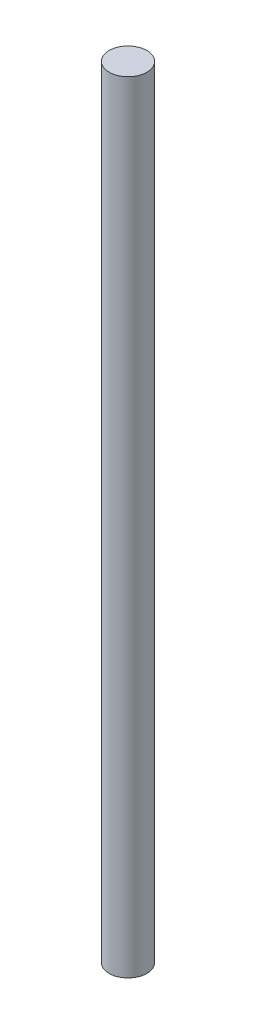
ISO-10303-21;
HEADER;
FILE_DESCRIPTION(('STEP AP214'),'2;1');
FILE_NAME('part.step','',(''),(''),'','','');
FILE_SCHEMA(('AUTOMOTIVE_DESIGN { 1 0 10303 214 1 1 1 1 }'));
ENDSEC;
DATA;
#1=APPLICATION_CONTEXT('core data for automotive mechanical design processes');
#2=APPLICATION_PROTOCOL_DEFINITION('international standard','automotive_design',2000,#1);
#3=PRODUCT_CONTEXT('',#1,'mechanical');
#4=PRODUCT('Part','Part','',(#3));
#5=PRODUCT_RELATED_PRODUCT_CATEGORY('part','',(#4));
#6=PRODUCT_DEFINITION_FORMATION('','',#4);
#7=PRODUCT_DEFINITION_CONTEXT('part definition',#1,'design');
#8=PRODUCT_DEFINITION('design','',#6,#7);
#9=PRODUCT_DEFINITION_SHAPE('','',#8);
#10=(LENGTH_UNIT() NAMED_UNIT(*) SI_UNIT(.MILLI.,.METRE.));
#11=(NAMED_UNIT(*) PLANE_ANGLE_UNIT() SI_UNIT($,.RADIAN.));
#12=(NAMED_UNIT(*) SI_UNIT($,.STERADIAN.) SOLID_ANGLE_UNIT());
#13=UNCERTAINTY_MEASURE_WITH_UNIT(LENGTH_MEASURE(1.E-05),#10,'distance_accuracy_value','');
#14=(GEOMETRIC_REPRESENTATION_CONTEXT(3) GLOBAL_UNCERTAINTY_ASSIGNED_CONTEXT((#13)) GLOBAL_UNIT_ASSIGNED_CONTEXT((#10,
#11,#12)) REPRESENTATION_CONTEXT('',''));
#15=CARTESIAN_POINT('',(0.,0.,0.));
#16=DIRECTION('',(0.,0.,1.));
#17=DIRECTION('',(1.,0.,0.));
#18=AXIS2_PLACEMENT_3D('',#15,#16,#17);
#19=CARTESIAN_POINT('',(0.,3683.,0.));
#20=DIRECTION('',(0.,-1.,0.));
#21=DIRECTION('',(0.,0.,-1.));
#22=AXIS2_PLACEMENT_3D('',#19,#20,#21);
#23=CYLINDRICAL_SURFACE('',#22,88.9);
#24=CARTESIAN_POINT('',(0.,3683.,0.));
#25=DIRECTION('',(0.,1.,0.));
#26=DIRECTION('',(0.,0.,1.));
#27=AXIS2_PLACEMENT_3D('',#24,#25,#26);
#28=CIRCLE('',#27,88.9);
#29=CARTESIAN_POINT('',(0.,3683.,-88.9));
#30=VERTEX_POINT('',#29);
#31=EDGE_CURVE('E10',#30,#30,#28,.T.);
#32=CARTESIAN_POINT('',(0.,0.,0.));
#33=DIRECTION('',(0.,1.,0.));
#34=DIRECTION('',(0.,0.,1.));
#35=AXIS2_PLACEMENT_3D('',#32,#33,#34);
#36=CIRCLE('',#35,88.9);
#37=CARTESIAN_POINT('',(0.,-4.44089209850063E-13,-88.9));
#38=VERTEX_POINT('',#37);
#39=EDGE_CURVE('E33',#38,#38,#36,.T.);
#40=CARTESIAN_POINT('',(0.,3683.,-88.9));
#41=CARTESIAN_POINT('',(0.,3644.63541666667,-88.9));
#42=CARTESIAN_POINT('',(0.,3606.27083333333,-88.9));
#43=CARTESIAN_POINT('',(0.,3529.54166666667,-88.9));
#44=CARTESIAN_POINT('',(0.,3491.17708333333,-88.9));
#45=CARTESIAN_POINT('',(0.,3414.44791666667,-88.9));
#46=CARTESIAN_POINT('',(0.,3376.08333333333,-88.9));
#47=CARTESIAN_POINT('',(0.,3299.35416666667,-88.9));
#48=CARTESIAN_POINT('',(0.,3260.98958333333,-88.9));
#49=CARTESIAN_POINT('',(0.,3184.26041666667,-88.9));
#50=CARTESIAN_POINT('',(0.,3145.89583333333,-88.9));
#51=CARTESIAN_POINT('',(0.,3069.16666666667,-88.9));
#52=CARTESIAN_POINT('',(0.,3030.80208333333,-88.9));
#53=CARTESIAN_POINT('',(0.,2954.07291666667,-88.9));
#54=CARTESIAN_POINT('',(0.,2915.70833333333,-88.9));
#55=CARTESIAN_POINT('',(0.,2838.97916666667,-88.9));
#56=CARTESIAN_POINT('',(0.,2800.61458333333,-88.9));
#57=CARTESIAN_POINT('',(0.,2723.88541666667,-88.9));
#58=CARTESIAN_POINT('',(0.,2685.52083333333,-88.9));
#59=CARTESIAN_POINT('',(0.,2608.79166666667,-88.9));
#60=CARTESIAN_POINT('',(0.,2570.42708333333,-88.9));
#61=CARTESIAN_POINT('',(0.,2493.69791666667,-88.9));
#62=CARTESIAN_POINT('',(0.,2455.33333333333,-88.9));
#63=CARTESIAN_POINT('',(0.,2378.60416666667,-88.9));
#64=CARTESIAN_POINT('',(0.,2340.23958333333,-88.9));
#65=CARTESIAN_POINT('',(0.,2263.51041666667,-88.9));
#66=CARTESIAN_POINT('',(0.,2225.14583333333,-88.9));
#67=CARTESIAN_POINT('',(0.,2148.41666666667,-88.9));
#68=CARTESIAN_POINT('',(0.,2110.05208333333,-88.9));
#69=CARTESIAN_POINT('',(0.,2033.32291666667,-88.9));
#70=CARTESIAN_POINT('',(0.,1994.95833333333,-88.9));
#71=CARTESIAN_POINT('',(0.,1918.22916666667,-88.9));
#72=CARTESIAN_POINT('',(0.,1879.86458333333,-88.9));
#73=CARTESIAN_POINT('',(0.,1803.13541666667,-88.9));
#74=CARTESIAN_POINT('',(0.,1764.77083333333,-88.9));
#75=CARTESIAN_POINT('',(0.,1688.04166666667,-88.9));
#76=CARTESIAN_POINT('',(0.,1649.67708333333,-88.9));
#77=CARTESIAN_POINT('',(0.,1572.94791666667,-88.9));
#78=CARTESIAN_POINT('',(0.,1534.58333333333,-88.9));
#79=CARTESIAN_POINT('',(0.,1457.85416666667,-88.9));
#80=CARTESIAN_POINT('',(0.,1419.48958333333,-88.9));
#81=CARTESIAN_POINT('',(0.,1342.76041666667,-88.9));
#82=CARTESIAN_POINT('',(0.,1304.39583333333,-88.9));
#83=CARTESIAN_POINT('',(0.,1227.66666666667,-88.9));
#84=CARTESIAN_POINT('',(0.,1189.30208333333,-88.9));
#85=CARTESIAN_POINT('',(0.,1112.57291666667,-88.9));
#86=CARTESIAN_POINT('',(0.,1074.20833333333,-88.9));
#87=CARTESIAN_POINT('',(0.,997.479166666666,-88.9));
#88=CARTESIAN_POINT('',(0.,959.114583333333,-88.9));
#89=CARTESIAN_POINT('',(0.,882.385416666666,-88.9));
#90=CARTESIAN_POINT('',(0.,844.020833333333,-88.9));
#91=CARTESIAN_POINT('',(0.,767.291666666666,-88.9));
#92=CARTESIAN_POINT('',(0.,728.927083333333,-88.9));
#93=CARTESIAN_POINT('',(0.,652.197916666666,-88.9));
#94=CARTESIAN_POINT('',(0.,613.833333333333,-88.9));
#95=CARTESIAN_POINT('',(0.,537.104166666666,-88.9));
#96=CARTESIAN_POINT('',(0.,498.739583333333,-88.9));
#97=CARTESIAN_POINT('',(0.,422.010416666666,-88.9));
#98=CARTESIAN_POINT('',(0.,383.645833333333,-88.9));
#99=CARTESIAN_POINT('',(0.,306.916666666666,-88.9));
#100=CARTESIAN_POINT('',(0.,268.552083333333,-88.9));
#101=CARTESIAN_POINT('',(0.,191.822916666666,-88.9));
#102=CARTESIAN_POINT('',(0.,153.458333333333,-88.9));
#103=CARTESIAN_POINT('',(0.,76.7291666666664,-88.9));
#104=CARTESIAN_POINT('',(0.,38.3645833333329,-88.9));
#105=CARTESIAN_POINT('',(0.,-4.44089209850063E-13,-88.9));
#106=B_SPLINE_CURVE_WITH_KNOTS('',3,(#40,#41,#42,#43,#44,#45,#46,#47,#48,#49,#50,#51,#52,#53,
#54,#55,#56,#57,#58,#59,#60,#61,#62,#63,#64,#65,#66,#67,#68,#69,#70,#71,#72,#73,#74,#75,#76,#77,
#78,#79,#80,#81,#82,#83,#84,#85,#86,#87,#88,#89,#90,#91,#92,#93,#94,#95,#96,#97,#98,#99,#100,
#101,#102,#103,#104,#105),.UNSPECIFIED.,.F.,.F.,(4,2,2,2,2,2,2,2,2,2,2,2,2,2,2,2,2,2,2,2,2,2,2,
2,2,2,2,2,2,2,2,2,4),(0.,115.09375,230.1875,345.28125,460.375,575.46875,690.5625,805.65625,
920.75,1035.84375,1150.9375,1266.03125,1381.125,1496.21875,1611.3125,1726.40625,1841.5,
1956.59375,2071.6875,2186.78125,2301.875,2416.96875,2532.0625,2647.15625,2762.25,2877.34375,
2992.4375,3107.53125,3222.625,3337.71875,3452.8125,3567.90625,3683.),.UNSPECIFIED.);
#107=EDGE_CURVE('BSEAM30',#30,#38,#106,.T.);
#108=ORIENTED_EDGE('',*,*,#31,.F.);
#109=ORIENTED_EDGE('',*,*,#39,.T.);
#110=ORIENTED_EDGE('',*,*,#107,.T.);
#111=ORIENTED_EDGE('',*,*,#107,.F.);
#112=EDGE_LOOP('',(#108,#110,#109,#111));
#113=FACE_BOUND('',#112,.T.);
#114=ADVANCED_FACE('F30',(#113),#23,.T.);
#115=CARTESIAN_POINT('',(0.,3683.,0.));
#116=DIRECTION('',(0.,1.,0.));
#117=DIRECTION('',(0.,0.,1.));
#118=AXIS2_PLACEMENT_3D('',#115,#116,#117);
#119=PLANE('',#118);
#120=ORIENTED_EDGE('',*,*,#31,.T.);
#121=EDGE_LOOP('',(#120));
#122=FACE_BOUND('',#121,.T.);
#123=ADVANCED_FACE('F45',(#122),#119,.T.);
#124=CARTESIAN_POINT('',(0.,0.,0.));
#125=DIRECTION('',(0.,1.,0.));
#126=DIRECTION('',(0.,0.,1.));
#127=AXIS2_PLACEMENT_3D('',#124,#125,#126);
#128=PLANE('',#127);
#129=ORIENTED_EDGE('',*,*,#39,.F.);
#130=EDGE_LOOP('',(#129));
#131=FACE_BOUND('',#130,.T.);
#132=ADVANCED_FACE('F43',(#131),#128,.F.);
#133=CLOSED_SHELL('',(#114,#123,#132));
#134=MANIFOLD_SOLID_BREP('B2',#133);
#135=ADVANCED_BREP_SHAPE_REPRESENTATION('',(#18,#134),#14);
#136=SHAPE_DEFINITION_REPRESENTATION(#9,#135);
ENDSEC;
END-ISO-10303-21;
